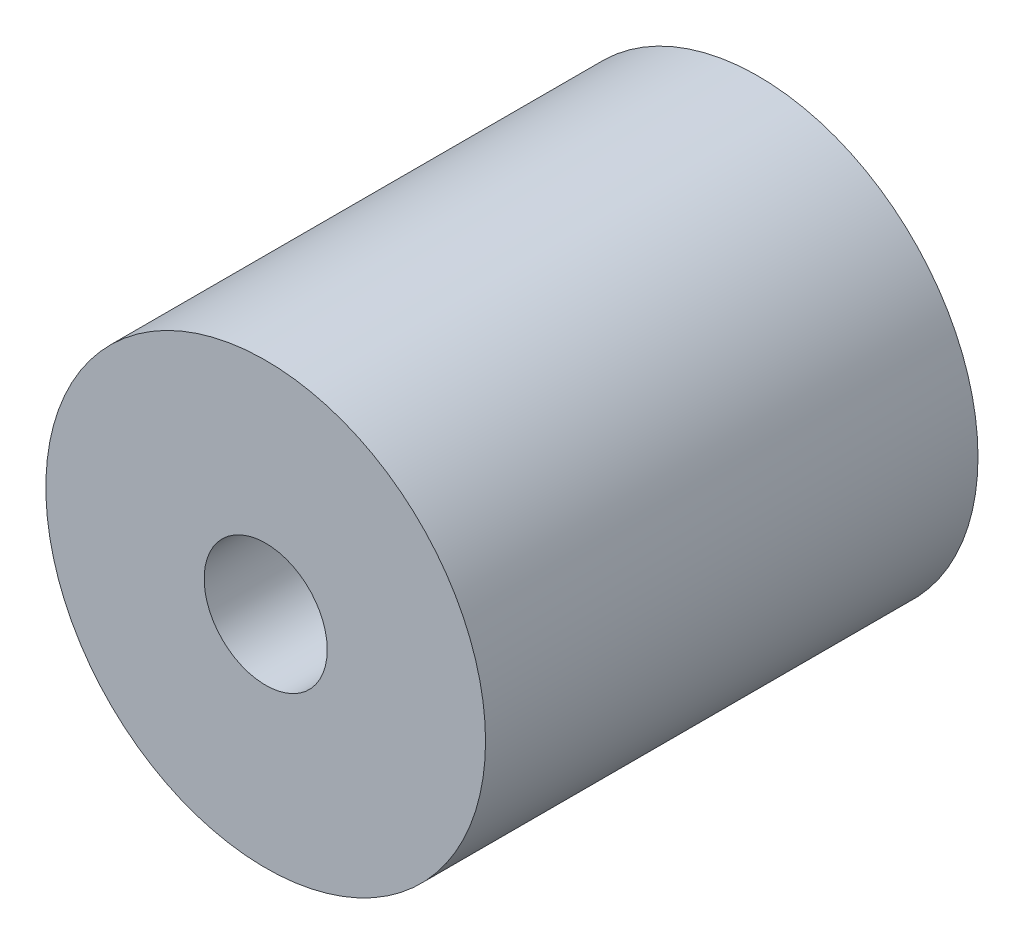
ISO-10303-21;
HEADER;
FILE_DESCRIPTION(('STEP AP214'),'2;1');
FILE_NAME('part.step','',(''),(''),'','','');
FILE_SCHEMA(('AUTOMOTIVE_DESIGN { 1 0 10303 214 1 1 1 1 }'));
ENDSEC;
DATA;
#1=APPLICATION_CONTEXT('core data for automotive mechanical design processes');
#2=APPLICATION_PROTOCOL_DEFINITION('international standard','automotive_design',2000,#1);
#3=PRODUCT_CONTEXT('',#1,'mechanical');
#4=PRODUCT('Part','Part','',(#3));
#5=PRODUCT_RELATED_PRODUCT_CATEGORY('part','',(#4));
#6=PRODUCT_DEFINITION_FORMATION('','',#4);
#7=PRODUCT_DEFINITION_CONTEXT('part definition',#1,'design');
#8=PRODUCT_DEFINITION('design','',#6,#7);
#9=PRODUCT_DEFINITION_SHAPE('','',#8);
#10=(LENGTH_UNIT() NAMED_UNIT(*) SI_UNIT(.MILLI.,.METRE.));
#11=(NAMED_UNIT(*) PLANE_ANGLE_UNIT() SI_UNIT($,.RADIAN.));
#12=(NAMED_UNIT(*) SI_UNIT($,.STERADIAN.) SOLID_ANGLE_UNIT());
#13=UNCERTAINTY_MEASURE_WITH_UNIT(LENGTH_MEASURE(1.E-05),#10,'distance_accuracy_value','');
#14=(GEOMETRIC_REPRESENTATION_CONTEXT(3) GLOBAL_UNCERTAINTY_ASSIGNED_CONTEXT((#13)) GLOBAL_UNIT_ASSIGNED_CONTEXT((#10,
#11,#12)) REPRESENTATION_CONTEXT('',''));
#15=CARTESIAN_POINT('',(0.,0.,0.));
#16=DIRECTION('',(0.,0.,1.));
#17=DIRECTION('',(1.,0.,0.));
#18=AXIS2_PLACEMENT_3D('',#15,#16,#17);
#19=CARTESIAN_POINT('',(0.,0.,14.));
#20=DIRECTION('',(0.,0.,-1.));
#21=DIRECTION('',(-1.,0.,0.));
#22=AXIS2_PLACEMENT_3D('',#19,#20,#21);
#23=CYLINDRICAL_SURFACE('',#22,6.25);
#24=CARTESIAN_POINT('',(0.,0.,14.));
#25=DIRECTION('',(0.,0.,1.));
#26=DIRECTION('',(1.,0.,0.));
#27=AXIS2_PLACEMENT_3D('',#24,#25,#26);
#28=CIRCLE('',#27,6.25);
#29=CARTESIAN_POINT('',(6.25,0.,14.));
#30=VERTEX_POINT('',#29);
#31=EDGE_CURVE('E10',#30,#30,#28,.T.);
#32=ORIENTED_EDGE('',*,*,#31,.F.);
#33=EDGE_LOOP('',(#32));
#34=FACE_BOUND('',#33,.T.);
#35=CARTESIAN_POINT('',(0.,0.,0.));
#36=DIRECTION('',(0.,0.,1.));
#37=DIRECTION('',(1.,0.,0.));
#38=AXIS2_PLACEMENT_3D('',#35,#36,#37);
#39=CIRCLE('',#38,6.25);
#40=CARTESIAN_POINT('',(6.25,0.,0.));
#41=VERTEX_POINT('',#40);
#42=EDGE_CURVE('E42',#41,#41,#39,.T.);
#43=ORIENTED_EDGE('',*,*,#42,.T.);
#44=EDGE_LOOP('',(#43));
#45=FACE_BOUND('',#44,.T.);
#46=ADVANCED_FACE('F39',(#34,#45),#23,.T.);
#47=CARTESIAN_POINT('',(0.,0.,14.));
#48=DIRECTION('',(0.,0.,1.));
#49=DIRECTION('',(1.,0.,0.));
#50=AXIS2_PLACEMENT_3D('',#47,#48,#49);
#51=PLANE('',#50);
#52=CARTESIAN_POINT('',(0.,0.,14.));
#53=DIRECTION('',(0.,0.,1.));
#54=DIRECTION('',(1.,0.,0.));
#55=AXIS2_PLACEMENT_3D('',#52,#53,#54);
#56=CIRCLE('',#55,1.75);
#57=CARTESIAN_POINT('',(1.75,0.,14.));
#58=VERTEX_POINT('',#57);
#59=EDGE_CURVE('E51',#58,#58,#56,.T.);
#60=ORIENTED_EDGE('',*,*,#59,.F.);
#61=EDGE_LOOP('',(#60));
#62=FACE_BOUND('',#61,.T.);
#63=ORIENTED_EDGE('',*,*,#31,.T.);
#64=EDGE_LOOP('',(#63));
#65=FACE_BOUND('',#64,.T.);
#66=ADVANCED_FACE('F75',(#62,#65),#51,.T.);
#67=CARTESIAN_POINT('',(0.,0.,0.));
#68=DIRECTION('',(0.,0.,1.));
#69=DIRECTION('',(1.,0.,0.));
#70=AXIS2_PLACEMENT_3D('',#67,#68,#69);
#71=PLANE('',#70);
#72=CARTESIAN_POINT('',(0.,0.,0.));
#73=DIRECTION('',(0.,0.,1.));
#74=DIRECTION('',(1.,0.,0.));
#75=AXIS2_PLACEMENT_3D('',#72,#73,#74);
#76=CIRCLE('',#75,3.375);
#77=CARTESIAN_POINT('',(3.375,0.,0.));
#78=VERTEX_POINT('',#77);
#79=EDGE_CURVE('E57',#78,#78,#76,.T.);
#80=ORIENTED_EDGE('',*,*,#79,.T.);
#81=EDGE_LOOP('',(#80));
#82=FACE_BOUND('',#81,.T.);
#83=ORIENTED_EDGE('',*,*,#42,.F.);
#84=EDGE_LOOP('',(#83));
#85=FACE_BOUND('',#84,.T.);
#86=ADVANCED_FACE('F80',(#82,#85),#71,.F.);
#87=CARTESIAN_POINT('',(0.,0.,8.5));
#88=DIRECTION('',(0.,0.,1.));
#89=DIRECTION('',(1.,0.,0.));
#90=AXIS2_PLACEMENT_3D('',#87,#88,#89);
#91=CYLINDRICAL_SURFACE('',#90,1.75);
#92=CARTESIAN_POINT('',(0.,0.,8.5));
#93=DIRECTION('',(0.,0.,1.));
#94=DIRECTION('',(1.,0.,0.));
#95=AXIS2_PLACEMENT_3D('',#92,#93,#94);
#96=CIRCLE('',#95,1.75);
#97=CARTESIAN_POINT('',(1.75,0.,8.5));
#98=VERTEX_POINT('',#97);
#99=EDGE_CURVE('E49',#98,#98,#96,.T.);
#100=ORIENTED_EDGE('',*,*,#99,.F.);
#101=EDGE_LOOP('',(#100));
#102=FACE_BOUND('',#101,.T.);
#103=ORIENTED_EDGE('',*,*,#59,.T.);
#104=EDGE_LOOP('',(#103));
#105=FACE_BOUND('',#104,.T.);
#106=ADVANCED_FACE('F87',(#102,#105),#91,.F.);
#107=CARTESIAN_POINT('',(0.,0.,8.5));
#108=DIRECTION('',(0.,0.,1.));
#109=DIRECTION('',(1.,0.,0.));
#110=AXIS2_PLACEMENT_3D('',#107,#108,#109);
#111=PLANE('',#110);
#112=ORIENTED_EDGE('',*,*,#99,.T.);
#113=EDGE_LOOP('',(#112));
#114=FACE_BOUND('',#113,.T.);
#115=ADVANCED_FACE('F72',(#114),#111,.T.);
#116=CARTESIAN_POINT('',(0.,0.,5.5));
#117=DIRECTION('',(0.,0.,-1.));
#118=DIRECTION('',(-1.,0.,0.));
#119=AXIS2_PLACEMENT_3D('',#116,#117,#118);
#120=CYLINDRICAL_SURFACE('',#119,3.375);
#121=CARTESIAN_POINT('',(0.,0.,5.5));
#122=DIRECTION('',(0.,0.,1.));
#123=DIRECTION('',(1.,0.,0.));
#124=AXIS2_PLACEMENT_3D('',#121,#122,#123);
#125=CIRCLE('',#124,3.375);
#126=CARTESIAN_POINT('',(3.375,0.,5.5));
#127=VERTEX_POINT('',#126);
#128=EDGE_CURVE('E54',#127,#127,#125,.T.);
#129=ORIENTED_EDGE('',*,*,#128,.T.);
#130=EDGE_LOOP('',(#129));
#131=FACE_BOUND('',#130,.T.);
#132=ORIENTED_EDGE('',*,*,#79,.F.);
#133=EDGE_LOOP('',(#132));
#134=FACE_BOUND('',#133,.T.);
#135=ADVANCED_FACE('F63',(#131,#134),#120,.F.);
#136=CARTESIAN_POINT('',(0.,0.,5.5));
#137=DIRECTION('',(0.,0.,1.));
#138=DIRECTION('',(1.,0.,0.));
#139=AXIS2_PLACEMENT_3D('',#136,#137,#138);
#140=PLANE('',#139);
#141=ORIENTED_EDGE('',*,*,#128,.F.);
#142=EDGE_LOOP('',(#141));
#143=FACE_BOUND('',#142,.T.);
#144=ADVANCED_FACE('F66',(#143),#140,.F.);
#145=CLOSED_SHELL('',(#46,#66,#86,#106,#115,#135,#144));
#146=MANIFOLD_SOLID_BREP('B2',#145);
#147=ADVANCED_BREP_SHAPE_REPRESENTATION('',(#18,#146),#14);
#148=SHAPE_DEFINITION_REPRESENTATION(#9,#147);
ENDSEC;
END-ISO-10303-21;
